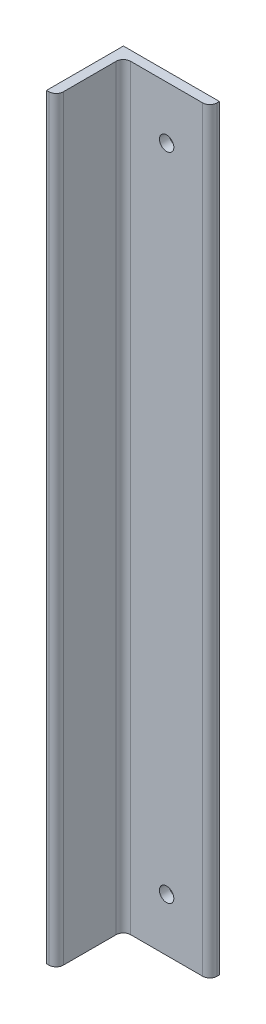
ISO-10303-21;
HEADER;
FILE_DESCRIPTION(('STEP AP214'),'2;1');
FILE_NAME('part.step','',(''),(''),'','','');
FILE_SCHEMA(('AUTOMOTIVE_DESIGN { 1 0 10303 214 1 1 1 1 }'));
ENDSEC;
DATA;
#1=APPLICATION_CONTEXT('core data for automotive mechanical design processes');
#2=APPLICATION_PROTOCOL_DEFINITION('international standard','automotive_design',2000,#1);
#3=PRODUCT_CONTEXT('',#1,'mechanical');
#4=PRODUCT('Part','Part','',(#3));
#5=PRODUCT_RELATED_PRODUCT_CATEGORY('part','',(#4));
#6=PRODUCT_DEFINITION_FORMATION('','',#4);
#7=PRODUCT_DEFINITION_CONTEXT('part definition',#1,'design');
#8=PRODUCT_DEFINITION('design','',#6,#7);
#9=PRODUCT_DEFINITION_SHAPE('','',#8);
#10=(LENGTH_UNIT() NAMED_UNIT(*) SI_UNIT(.MILLI.,.METRE.));
#11=(NAMED_UNIT(*) PLANE_ANGLE_UNIT() SI_UNIT($,.RADIAN.));
#12=(NAMED_UNIT(*) SI_UNIT($,.STERADIAN.) SOLID_ANGLE_UNIT());
#13=UNCERTAINTY_MEASURE_WITH_UNIT(LENGTH_MEASURE(1.E-05),#10,'distance_accuracy_value','');
#14=(GEOMETRIC_REPRESENTATION_CONTEXT(3) GLOBAL_UNCERTAINTY_ASSIGNED_CONTEXT((#13)) GLOBAL_UNIT_ASSIGNED_CONTEXT((#10,
#11,#12)) REPRESENTATION_CONTEXT('',''));
#15=CARTESIAN_POINT('',(0.,0.,0.));
#16=DIRECTION('',(0.,0.,1.));
#17=DIRECTION('',(1.,0.,0.));
#18=AXIS2_PLACEMENT_3D('',#15,#16,#17);
#19=CARTESIAN_POINT('',(0.,500.,50.7999999999999));
#20=DIRECTION('',(1.,0.,0.));
#21=DIRECTION('',(0.,0.,-1.));
#22=AXIS2_PLACEMENT_3D('',#19,#20,#21);
#23=PLANE('',#22);
#24=DIRECTION('',(0.,0.,1.));
#25=VECTOR('',#24,1.);
#26=CARTESIAN_POINT('',(0.,0.,50.7999999999999));
#27=LINE('',#26,#25);
#28=CARTESIAN_POINT('',(0.,0.,0.));
#29=VERTEX_POINT('',#28);
#30=CARTESIAN_POINT('',(0.,0.,50.7999999999999));
#31=VERTEX_POINT('',#30);
#32=EDGE_CURVE('E168',#29,#31,#27,.T.);
#33=ORIENTED_EDGE('',*,*,#32,.T.);
#34=DIRECTION('',(0.,-1.,0.));
#35=VECTOR('',#34,1.);
#36=CARTESIAN_POINT('',(0.,500.,50.7999999999999));
#37=LINE('',#36,#35);
#38=CARTESIAN_POINT('',(0.,500.,50.7999999999999));
#39=VERTEX_POINT('',#38);
#40=EDGE_CURVE('E13',#39,#31,#37,.T.);
#41=ORIENTED_EDGE('',*,*,#40,.F.);
#42=DIRECTION('',(0.,0.,1.));
#43=VECTOR('',#42,1.);
#44=CARTESIAN_POINT('',(0.,500.,50.7999999999999));
#45=LINE('',#44,#43);
#46=CARTESIAN_POINT('',(0.,500.,0.));
#47=VERTEX_POINT('',#46);
#48=EDGE_CURVE('E185',#47,#39,#45,.T.);
#49=ORIENTED_EDGE('',*,*,#48,.F.);
#50=DIRECTION('',(0.,-1.,0.));
#51=VECTOR('',#50,1.);
#52=CARTESIAN_POINT('',(0.,500.,0.));
#53=LINE('',#52,#51);
#54=EDGE_CURVE('E164',#47,#29,#53,.T.);
#55=ORIENTED_EDGE('',*,*,#54,.T.);
#56=EDGE_LOOP('',(#33,#41,#49,#55));
#57=FACE_BOUND('',#56,.T.);
#58=ADVANCED_FACE('F66',(#57),#23,.F.);
#59=CARTESIAN_POINT('',(1.59258,500.,50.7999999999999));
#60=DIRECTION('',(0.,0.,-1.));
#61=DIRECTION('',(-1.,0.,0.));
#62=AXIS2_PLACEMENT_3D('',#59,#60,#61);
#63=PLANE('',#62);
#64=DIRECTION('',(1.,0.,0.));
#65=VECTOR('',#64,1.);
#66=CARTESIAN_POINT('',(1.59258,0.,50.7999999999999));
#67=LINE('',#66,#65);
#68=CARTESIAN_POINT('',(1.59258,0.,50.7999999999999));
#69=VERTEX_POINT('',#68);
#70=EDGE_CURVE('E171',#31,#69,#67,.T.);
#71=ORIENTED_EDGE('',*,*,#70,.T.);
#72=DIRECTION('',(0.,-1.,0.));
#73=VECTOR('',#72,1.);
#74=CARTESIAN_POINT('',(1.59258,500.,50.7999999999999));
#75=LINE('',#74,#73);
#76=CARTESIAN_POINT('',(1.59258,500.,50.7999999999999));
#77=VERTEX_POINT('',#76);
#78=EDGE_CURVE('E74',#77,#69,#75,.T.);
#79=ORIENTED_EDGE('',*,*,#78,.F.);
#80=DIRECTION('',(1.,0.,0.));
#81=VECTOR('',#80,1.);
#82=CARTESIAN_POINT('',(1.59258,500.,50.7999999999999));
#83=LINE('',#82,#81);
#84=EDGE_CURVE('E128',#39,#77,#83,.T.);
#85=ORIENTED_EDGE('',*,*,#84,.F.);
#86=ORIENTED_EDGE('',*,*,#40,.T.);
#87=EDGE_LOOP('',(#71,#79,#85,#86));
#88=FACE_BOUND('',#87,.T.);
#89=ADVANCED_FACE('F267',(#88),#63,.F.);
#90=CARTESIAN_POINT('',(1.59258,500.,46.0425799999999));
#91=DIRECTION('',(0.,-1.,0.));
#92=DIRECTION('',(0.,0.,-1.));
#93=AXIS2_PLACEMENT_3D('',#90,#91,#92);
#94=CYLINDRICAL_SURFACE('',#93,4.75742);
#95=CARTESIAN_POINT('',(1.59258,0.,46.0425799999999));
#96=DIRECTION('',(0.,1.,0.));
#97=DIRECTION('',(0.,0.,1.));
#98=AXIS2_PLACEMENT_3D('',#95,#96,#97);
#99=CIRCLE('',#98,4.75742);
#100=CARTESIAN_POINT('',(6.34999999999999,0.,46.0425799999999));
#101=VERTEX_POINT('',#100);
#102=EDGE_CURVE('E174',#69,#101,#99,.T.);
#103=ORIENTED_EDGE('',*,*,#102,.T.);
#104=DIRECTION('',(0.,-1.,0.));
#105=VECTOR('',#104,1.);
#106=CARTESIAN_POINT('',(6.34999999999999,500.,46.0425799999999));
#107=LINE('',#106,#105);
#108=CARTESIAN_POINT('',(6.34999999999999,500.,46.0425799999999));
#109=VERTEX_POINT('',#108);
#110=EDGE_CURVE('E195',#109,#101,#107,.T.);
#111=ORIENTED_EDGE('',*,*,#110,.F.);
#112=CARTESIAN_POINT('',(1.59258,500.,46.0425799999999));
#113=DIRECTION('',(0.,1.,0.));
#114=DIRECTION('',(0.,0.,1.));
#115=AXIS2_PLACEMENT_3D('',#112,#113,#114);
#116=CIRCLE('',#115,4.75742);
#117=EDGE_CURVE('E203',#77,#109,#116,.T.);
#118=ORIENTED_EDGE('',*,*,#117,.F.);
#119=ORIENTED_EDGE('',*,*,#78,.T.);
#120=EDGE_LOOP('',(#103,#111,#118,#119));
#121=FACE_BOUND('',#120,.T.);
#122=ADVANCED_FACE('F201',(#121),#94,.T.);
#123=CARTESIAN_POINT('',(6.34999999999999,500.,11.1125));
#124=DIRECTION('',(-1.,0.,0.));
#125=DIRECTION('',(0.,0.,1.));
#126=AXIS2_PLACEMENT_3D('',#123,#124,#125);
#127=PLANE('',#126);
#128=DIRECTION('',(0.,0.,-1.));
#129=VECTOR('',#128,1.);
#130=CARTESIAN_POINT('',(6.34999999999999,0.,11.1125));
#131=LINE('',#130,#129);
#132=CARTESIAN_POINT('',(6.35,0.,11.1125));
#133=VERTEX_POINT('',#132);
#134=EDGE_CURVE('E176',#101,#133,#131,.T.);
#135=ORIENTED_EDGE('',*,*,#134,.T.);
#136=DIRECTION('',(0.,-1.,0.));
#137=VECTOR('',#136,1.);
#138=CARTESIAN_POINT('',(6.35,500.,11.1125));
#139=LINE('',#138,#137);
#140=CARTESIAN_POINT('',(6.35,500.,11.1125));
#141=VERTEX_POINT('',#140);
#142=EDGE_CURVE('E192',#141,#133,#139,.T.);
#143=ORIENTED_EDGE('',*,*,#142,.F.);
#144=DIRECTION('',(0.,0.,-1.));
#145=VECTOR('',#144,1.);
#146=CARTESIAN_POINT('',(6.34999999999999,500.,11.1125));
#147=LINE('',#146,#145);
#148=EDGE_CURVE('E219',#109,#141,#147,.T.);
#149=ORIENTED_EDGE('',*,*,#148,.F.);
#150=ORIENTED_EDGE('',*,*,#110,.T.);
#151=EDGE_LOOP('',(#135,#143,#149,#150));
#152=FACE_BOUND('',#151,.T.);
#153=ADVANCED_FACE('F212',(#152),#127,.F.);
#154=CARTESIAN_POINT('',(11.1125,500.,11.1125));
#155=DIRECTION('',(0.,-1.,0.));
#156=DIRECTION('',(0.,0.,-1.));
#157=AXIS2_PLACEMENT_3D('',#154,#155,#156);
#158=CYLINDRICAL_SURFACE('',#157,4.7625);
#159=CARTESIAN_POINT('',(11.1125,0.,11.1125));
#160=DIRECTION('',(0.,-1.,0.));
#161=DIRECTION('',(0.,0.,-1.));
#162=AXIS2_PLACEMENT_3D('',#159,#160,#161);
#163=CIRCLE('',#162,4.7625);
#164=CARTESIAN_POINT('',(11.1125,0.,6.34999999999998));
#165=VERTEX_POINT('',#164);
#166=EDGE_CURVE('E178',#133,#165,#163,.T.);
#167=ORIENTED_EDGE('',*,*,#166,.T.);
#168=DIRECTION('',(0.,-1.,0.));
#169=VECTOR('',#168,1.);
#170=CARTESIAN_POINT('',(11.1125,500.,6.34999999999998));
#171=LINE('',#170,#169);
#172=CARTESIAN_POINT('',(11.1125,500.,6.34999999999998));
#173=VERTEX_POINT('',#172);
#174=EDGE_CURVE('E189',#173,#165,#171,.T.);
#175=ORIENTED_EDGE('',*,*,#174,.F.);
#176=CARTESIAN_POINT('',(11.1125,500.,11.1125));
#177=DIRECTION('',(0.,-1.,0.));
#178=DIRECTION('',(0.,0.,-1.));
#179=AXIS2_PLACEMENT_3D('',#176,#177,#178);
#180=CIRCLE('',#179,4.7625);
#181=EDGE_CURVE('E218',#141,#173,#180,.T.);
#182=ORIENTED_EDGE('',*,*,#181,.F.);
#183=ORIENTED_EDGE('',*,*,#142,.T.);
#184=EDGE_LOOP('',(#167,#175,#182,#183));
#185=FACE_BOUND('',#184,.T.);
#186=ADVANCED_FACE('F216',(#185),#158,.F.);
#187=CARTESIAN_POINT('',(58.74258,500.,6.34999999999997));
#188=DIRECTION('',(0.,0.,-1.));
#189=DIRECTION('',(-1.,0.,0.));
#190=AXIS2_PLACEMENT_3D('',#187,#188,#189);
#191=PLANE('',#190);
#192=CARTESIAN_POINT('',(34.92754,465.,6.34999999999998));
#193=DIRECTION('',(0.,0.,1.));
#194=DIRECTION('',(1.,0.,0.));
#195=AXIS2_PLACEMENT_3D('',#192,#193,#194);
#196=CIRCLE('',#195,4.7625);
#197=CARTESIAN_POINT('',(39.69004,465.,6.34999999999998));
#198=VERTEX_POINT('',#197);
#199=EDGE_CURVE('E232',#198,#198,#196,.T.);
#200=ORIENTED_EDGE('',*,*,#199,.F.);
#201=EDGE_LOOP('',(#200));
#202=FACE_BOUND('',#201,.T.);
#203=CARTESIAN_POINT('',(34.9275400000001,35.,6.34999999999998));
#204=DIRECTION('',(0.,0.,1.));
#205=DIRECTION('',(1.,0.,0.));
#206=AXIS2_PLACEMENT_3D('',#203,#204,#205);
#207=CIRCLE('',#206,4.7625);
#208=CARTESIAN_POINT('',(39.6900400000001,35.,6.34999999999998));
#209=VERTEX_POINT('',#208);
#210=EDGE_CURVE('E226',#209,#209,#207,.T.);
#211=ORIENTED_EDGE('',*,*,#210,.F.);
#212=EDGE_LOOP('',(#211));
#213=FACE_BOUND('',#212,.T.);
#214=DIRECTION('',(1.,0.,0.));
#215=VECTOR('',#214,1.);
#216=CARTESIAN_POINT('',(58.74258,0.,6.34999999999997));
#217=LINE('',#216,#215);
#218=CARTESIAN_POINT('',(58.74258,0.,6.34999999999998));
#219=VERTEX_POINT('',#218);
#220=EDGE_CURVE('E180',#165,#219,#217,.T.);
#221=ORIENTED_EDGE('',*,*,#220,.T.);
#222=DIRECTION('',(0.,-1.,0.));
#223=VECTOR('',#222,1.);
#224=CARTESIAN_POINT('',(58.74258,500.,6.34999999999998));
#225=LINE('',#224,#223);
#226=CARTESIAN_POINT('',(58.74258,500.,6.34999999999998));
#227=VERTEX_POINT('',#226);
#228=EDGE_CURVE('E159',#227,#219,#225,.T.);
#229=ORIENTED_EDGE('',*,*,#228,.F.);
#230=DIRECTION('',(1.,0.,0.));
#231=VECTOR('',#230,1.);
#232=CARTESIAN_POINT('',(58.74258,500.,6.34999999999997));
#233=LINE('',#232,#231);
#234=EDGE_CURVE('E150',#173,#227,#233,.T.);
#235=ORIENTED_EDGE('',*,*,#234,.F.);
#236=ORIENTED_EDGE('',*,*,#174,.T.);
#237=EDGE_LOOP('',(#221,#229,#235,#236));
#238=FACE_BOUND('',#237,.T.);
#239=ADVANCED_FACE('F248',(#202,#213,#238),#191,.F.);
#240=CARTESIAN_POINT('',(58.74258,500.,1.59257999999997));
#241=DIRECTION('',(0.,-1.,0.));
#242=DIRECTION('',(0.,0.,-1.));
#243=AXIS2_PLACEMENT_3D('',#240,#241,#242);
#244=CYLINDRICAL_SURFACE('',#243,4.75742);
#245=CARTESIAN_POINT('',(58.74258,0.,1.59257999999997));
#246=DIRECTION('',(0.,1.,0.));
#247=DIRECTION('',(0.,0.,-1.));
#248=AXIS2_PLACEMENT_3D('',#245,#246,#247);
#249=CIRCLE('',#248,4.75742);
#250=CARTESIAN_POINT('',(63.5,0.,1.59257999999997));
#251=VERTEX_POINT('',#250);
#252=EDGE_CURVE('E158',#219,#251,#249,.T.);
#253=ORIENTED_EDGE('',*,*,#252,.T.);
#254=DIRECTION('',(0.,-1.,0.));
#255=VECTOR('',#254,1.);
#256=CARTESIAN_POINT('',(63.5,500.,1.59257999999997));
#257=LINE('',#256,#255);
#258=CARTESIAN_POINT('',(63.5,500.,1.59257999999997));
#259=VERTEX_POINT('',#258);
#260=EDGE_CURVE('E155',#259,#251,#257,.T.);
#261=ORIENTED_EDGE('',*,*,#260,.F.);
#262=CARTESIAN_POINT('',(58.74258,500.,1.59257999999997));
#263=DIRECTION('',(0.,1.,0.));
#264=DIRECTION('',(0.,0.,-1.));
#265=AXIS2_PLACEMENT_3D('',#262,#263,#264);
#266=CIRCLE('',#265,4.75742);
#267=EDGE_CURVE('E144',#227,#259,#266,.T.);
#268=ORIENTED_EDGE('',*,*,#267,.F.);
#269=ORIENTED_EDGE('',*,*,#228,.T.);
#270=EDGE_LOOP('',(#253,#261,#268,#269));
#271=FACE_BOUND('',#270,.T.);
#272=ADVANCED_FACE('F156',(#271),#244,.T.);
#273=CARTESIAN_POINT('',(63.5,500.,0.));
#274=DIRECTION('',(-1.,0.,0.));
#275=DIRECTION('',(0.,0.,1.));
#276=AXIS2_PLACEMENT_3D('',#273,#274,#275);
#277=PLANE('',#276);
#278=DIRECTION('',(0.,0.,-1.));
#279=VECTOR('',#278,1.);
#280=CARTESIAN_POINT('',(63.5,0.,0.));
#281=LINE('',#280,#279);
#282=CARTESIAN_POINT('',(63.5,0.,0.));
#283=VERTEX_POINT('',#282);
#284=EDGE_CURVE('E114',#251,#283,#281,.T.);
#285=ORIENTED_EDGE('',*,*,#284,.T.);
#286=DIRECTION('',(0.,-1.,0.));
#287=VECTOR('',#286,1.);
#288=CARTESIAN_POINT('',(63.5,500.,0.));
#289=LINE('',#288,#287);
#290=CARTESIAN_POINT('',(63.5,500.,0.));
#291=VERTEX_POINT('',#290);
#292=EDGE_CURVE('E160',#291,#283,#289,.T.);
#293=ORIENTED_EDGE('',*,*,#292,.F.);
#294=DIRECTION('',(0.,0.,-1.));
#295=VECTOR('',#294,1.);
#296=CARTESIAN_POINT('',(63.5,500.,0.));
#297=LINE('',#296,#295);
#298=EDGE_CURVE('E148',#259,#291,#297,.T.);
#299=ORIENTED_EDGE('',*,*,#298,.F.);
#300=ORIENTED_EDGE('',*,*,#260,.T.);
#301=EDGE_LOOP('',(#285,#293,#299,#300));
#302=FACE_BOUND('',#301,.T.);
#303=ADVANCED_FACE('F162',(#302),#277,.F.);
#304=CARTESIAN_POINT('',(0.,500.,0.));
#305=DIRECTION('',(0.,0.,1.));
#306=DIRECTION('',(1.,0.,0.));
#307=AXIS2_PLACEMENT_3D('',#304,#305,#306);
#308=PLANE('',#307);
#309=CARTESIAN_POINT('',(34.92754,465.,0.));
#310=DIRECTION('',(0.,0.,1.));
#311=DIRECTION('',(1.,0.,0.));
#312=AXIS2_PLACEMENT_3D('',#309,#310,#311);
#313=CIRCLE('',#312,4.7625);
#314=CARTESIAN_POINT('',(39.69004,465.,0.));
#315=VERTEX_POINT('',#314);
#316=EDGE_CURVE('E172',#315,#315,#313,.T.);
#317=ORIENTED_EDGE('',*,*,#316,.T.);
#318=EDGE_LOOP('',(#317));
#319=FACE_BOUND('',#318,.T.);
#320=CARTESIAN_POINT('',(34.9275400000001,35.,0.));
#321=DIRECTION('',(0.,0.,1.));
#322=DIRECTION('',(1.,0.,0.));
#323=AXIS2_PLACEMENT_3D('',#320,#321,#322);
#324=CIRCLE('',#323,4.7625);
#325=CARTESIAN_POINT('',(39.6900400000001,35.,0.));
#326=VERTEX_POINT('',#325);
#327=EDGE_CURVE('E229',#326,#326,#324,.T.);
#328=ORIENTED_EDGE('',*,*,#327,.T.);
#329=EDGE_LOOP('',(#328));
#330=FACE_BOUND('',#329,.T.);
#331=DIRECTION('',(-1.,0.,0.));
#332=VECTOR('',#331,1.);
#333=CARTESIAN_POINT('',(0.,0.,0.));
#334=LINE('',#333,#332);
#335=EDGE_CURVE('E120',#283,#29,#334,.T.);
#336=ORIENTED_EDGE('',*,*,#335,.T.);
#337=ORIENTED_EDGE('',*,*,#54,.F.);
#338=DIRECTION('',(-1.,0.,0.));
#339=VECTOR('',#338,1.);
#340=CARTESIAN_POINT('',(0.,500.,0.));
#341=LINE('',#340,#339);
#342=EDGE_CURVE('E82',#291,#47,#341,.T.);
#343=ORIENTED_EDGE('',*,*,#342,.F.);
#344=ORIENTED_EDGE('',*,*,#292,.T.);
#345=EDGE_LOOP('',(#336,#337,#343,#344));
#346=FACE_BOUND('',#345,.T.);
#347=ADVANCED_FACE('F238',(#319,#330,#346),#308,.F.);
#348=CARTESIAN_POINT('',(58.74258,500.,1.59257999999997));
#349=DIRECTION('',(0.,-1.,0.));
#350=DIRECTION('',(0.,0.,-1.));
#351=AXIS2_PLACEMENT_3D('',#348,#349,#350);
#352=PLANE('',#351);
#353=ORIENTED_EDGE('',*,*,#48,.T.);
#354=ORIENTED_EDGE('',*,*,#84,.T.);
#355=ORIENTED_EDGE('',*,*,#117,.T.);
#356=ORIENTED_EDGE('',*,*,#148,.T.);
#357=ORIENTED_EDGE('',*,*,#181,.T.);
#358=ORIENTED_EDGE('',*,*,#234,.T.);
#359=ORIENTED_EDGE('',*,*,#267,.T.);
#360=ORIENTED_EDGE('',*,*,#298,.T.);
#361=ORIENTED_EDGE('',*,*,#342,.T.);
#362=EDGE_LOOP('',(#353,#354,#355,#356,#357,#358,#359,#360,#361));
#363=FACE_BOUND('',#362,.T.);
#364=ADVANCED_FACE('F146',(#363),#352,.F.);
#365=CARTESIAN_POINT('',(58.74258,0.,1.59257999999997));
#366=DIRECTION('',(0.,-1.,0.));
#367=DIRECTION('',(0.,0.,-1.));
#368=AXIS2_PLACEMENT_3D('',#365,#366,#367);
#369=PLANE('',#368);
#370=ORIENTED_EDGE('',*,*,#32,.F.);
#371=ORIENTED_EDGE('',*,*,#335,.F.);
#372=ORIENTED_EDGE('',*,*,#284,.F.);
#373=ORIENTED_EDGE('',*,*,#252,.F.);
#374=ORIENTED_EDGE('',*,*,#220,.F.);
#375=ORIENTED_EDGE('',*,*,#166,.F.);
#376=ORIENTED_EDGE('',*,*,#134,.F.);
#377=ORIENTED_EDGE('',*,*,#102,.F.);
#378=ORIENTED_EDGE('',*,*,#70,.F.);
#379=EDGE_LOOP('',(#370,#371,#372,#373,#374,#375,#376,#377,#378));
#380=FACE_BOUND('',#379,.T.);
#381=ADVANCED_FACE('F207',(#380),#369,.T.);
#382=CARTESIAN_POINT('',(34.9275400000001,35.,0.));
#383=DIRECTION('',(0.,0.,1.));
#384=DIRECTION('',(1.,0.,0.));
#385=AXIS2_PLACEMENT_3D('',#382,#383,#384);
#386=CYLINDRICAL_SURFACE('',#385,4.7625);
#387=CARTESIAN_POINT('',(39.6900400000001,35.,0.));
#388=CARTESIAN_POINT('',(39.6900400000001,35.,0.0661458333333022));
#389=CARTESIAN_POINT('',(39.6900400000001,35.,0.132291666666636));
#390=CARTESIAN_POINT('',(39.6900400000001,35.,0.264583333333303));
#391=CARTESIAN_POINT('',(39.6900400000001,35.,0.330729166666636));
#392=CARTESIAN_POINT('',(39.6900400000001,35.,0.463020833333303));
#393=CARTESIAN_POINT('',(39.6900400000001,35.,0.529166666666637));
#394=CARTESIAN_POINT('',(39.6900400000001,35.,0.661458333333304));
#395=CARTESIAN_POINT('',(39.6900400000001,35.,0.727604166666637));
#396=CARTESIAN_POINT('',(39.6900400000001,35.,0.859895833333304));
#397=CARTESIAN_POINT('',(39.6900400000001,35.,0.926041666666638));
#398=CARTESIAN_POINT('',(39.6900400000001,35.,1.0583333333333));
#399=CARTESIAN_POINT('',(39.6900400000001,35.,1.12447916666664));
#400=CARTESIAN_POINT('',(39.6900400000001,35.,1.2567708333333));
#401=CARTESIAN_POINT('',(39.6900400000001,35.,1.32291666666664));
#402=CARTESIAN_POINT('',(39.6900400000001,35.,1.45520833333331));
#403=CARTESIAN_POINT('',(39.6900400000001,35.,1.52135416666664));
#404=CARTESIAN_POINT('',(39.6900400000001,35.,1.65364583333331));
#405=CARTESIAN_POINT('',(39.6900400000001,35.,1.71979166666664));
#406=CARTESIAN_POINT('',(39.6900400000001,35.,1.85208333333331));
#407=CARTESIAN_POINT('',(39.6900400000001,35.,1.91822916666664));
#408=CARTESIAN_POINT('',(39.6900400000001,35.,2.05052083333331));
#409=CARTESIAN_POINT('',(39.6900400000001,35.,2.11666666666664));
#410=CARTESIAN_POINT('',(39.6900400000001,35.,2.24895833333331));
#411=CARTESIAN_POINT('',(39.6900400000001,35.,2.31510416666664));
#412=CARTESIAN_POINT('',(39.6900400000001,35.,2.44739583333331));
#413=CARTESIAN_POINT('',(39.6900400000001,35.,2.51354166666664));
#414=CARTESIAN_POINT('',(39.6900400000001,35.,2.64583333333331));
#415=CARTESIAN_POINT('',(39.6900400000001,35.,2.71197916666664));
#416=CARTESIAN_POINT('',(39.6900400000001,35.,2.84427083333331));
#417=CARTESIAN_POINT('',(39.6900400000001,35.,2.91041666666664));
#418=CARTESIAN_POINT('',(39.6900400000001,35.,3.04270833333331));
#419=CARTESIAN_POINT('',(39.6900400000001,35.,3.10885416666664));
#420=CARTESIAN_POINT('',(39.6900400000001,35.,3.24114583333331));
#421=CARTESIAN_POINT('',(39.6900400000001,35.,3.30729166666664));
#422=CARTESIAN_POINT('',(39.6900400000001,35.,3.43958333333331));
#423=CARTESIAN_POINT('',(39.6900400000001,35.,3.50572916666664));
#424=CARTESIAN_POINT('',(39.6900400000001,35.,3.63802083333331));
#425=CARTESIAN_POINT('',(39.6900400000001,35.,3.70416666666664));
#426=CARTESIAN_POINT('',(39.6900400000001,35.,3.83645833333331));
#427=CARTESIAN_POINT('',(39.6900400000001,35.,3.90260416666664));
#428=CARTESIAN_POINT('',(39.6900400000001,35.,4.03489583333331));
#429=CARTESIAN_POINT('',(39.6900400000001,35.,4.10104166666664));
#430=CARTESIAN_POINT('',(39.6900400000001,35.,4.23333333333331));
#431=CARTESIAN_POINT('',(39.6900400000001,35.,4.29947916666664));
#432=CARTESIAN_POINT('',(39.6900400000001,35.,4.43177083333331));
#433=CARTESIAN_POINT('',(39.6900400000001,35.,4.49791666666664));
#434=CARTESIAN_POINT('',(39.6900400000001,35.,4.63020833333331));
#435=CARTESIAN_POINT('',(39.6900400000001,35.,4.69635416666665));
#436=CARTESIAN_POINT('',(39.6900400000001,35.,4.82864583333331));
#437=CARTESIAN_POINT('',(39.6900400000001,35.,4.89479166666665));
#438=CARTESIAN_POINT('',(39.6900400000001,35.,5.02708333333331));
#439=CARTESIAN_POINT('',(39.6900400000001,35.,5.09322916666665));
#440=CARTESIAN_POINT('',(39.6900400000001,35.,5.22552083333331));
#441=CARTESIAN_POINT('',(39.6900400000001,35.,5.29166666666665));
#442=CARTESIAN_POINT('',(39.6900400000001,35.,5.42395833333331));
#443=CARTESIAN_POINT('',(39.6900400000001,35.,5.49010416666665));
#444=CARTESIAN_POINT('',(39.6900400000001,35.,5.62239583333332));
#445=CARTESIAN_POINT('',(39.6900400000001,35.,5.68854166666665));
#446=CARTESIAN_POINT('',(39.6900400000001,35.,5.82083333333332));
#447=CARTESIAN_POINT('',(39.6900400000001,35.,5.88697916666665));
#448=CARTESIAN_POINT('',(39.6900400000001,35.,6.01927083333332));
#449=CARTESIAN_POINT('',(39.6900400000001,35.,6.08541666666665));
#450=CARTESIAN_POINT('',(39.6900400000001,35.,6.21770833333332));
#451=CARTESIAN_POINT('',(39.6900400000001,35.,6.28385416666665));
#452=CARTESIAN_POINT('',(39.6900400000001,35.,6.34999999999998));
#453=B_SPLINE_CURVE_WITH_KNOTS('',3,(#387,#388,#389,#390,#391,#392,#393,#394,#395,#396,#397,
#398,#399,#400,#401,#402,#403,#404,#405,#406,#407,#408,#409,#410,#411,#412,#413,#414,#415,#416,
#417,#418,#419,#420,#421,#422,#423,#424,#425,#426,#427,#428,#429,#430,#431,#432,#433,#434,#435,
#436,#437,#438,#439,#440,#441,#442,#443,#444,#445,#446,#447,#448,#449,#450,#451,#452),
.UNSPECIFIED.,.F.,.F.,(4,2,2,2,2,2,2,2,2,2,2,2,2,2,2,2,2,2,2,2,2,2,2,2,2,2,2,2,2,2,2,2,4),(0.,
0.1984375,0.396875000000001,0.595312500000001,0.793750000000002,0.992187500000002,1.190625,
1.3890625,1.5875,1.7859375,1.984375,2.1828125,2.38125000000001,2.57968750000001,
2.77812500000001,2.97656250000001,3.17500000000001,3.37343750000001,3.57187500000001,
3.77031250000001,3.96875000000001,4.16718750000001,4.36562500000001,4.56406250000001,
4.76250000000001,4.96093750000001,5.15937500000001,5.35781250000001,5.55625000000001,
5.75468750000001,5.95312500000001,6.15156250000001,6.35000000000001),.UNSPECIFIED.);
#454=EDGE_CURVE('BSEAM244',#326,#209,#453,.T.);
#455=ORIENTED_EDGE('',*,*,#327,.F.);
#456=ORIENTED_EDGE('',*,*,#210,.T.);
#457=ORIENTED_EDGE('',*,*,#454,.T.);
#458=ORIENTED_EDGE('',*,*,#454,.F.);
#459=EDGE_LOOP('',(#455,#457,#456,#458));
#460=FACE_BOUND('',#459,.T.);
#461=ADVANCED_FACE('F244',(#460),#386,.F.);
#462=CARTESIAN_POINT('',(34.92754,465.,0.));
#463=DIRECTION('',(0.,0.,1.));
#464=DIRECTION('',(1.,0.,0.));
#465=AXIS2_PLACEMENT_3D('',#462,#463,#464);
#466=CYLINDRICAL_SURFACE('',#465,4.7625);
#467=CARTESIAN_POINT('',(39.69004,465.,0.));
#468=CARTESIAN_POINT('',(39.69004,465.,0.0661458333333022));
#469=CARTESIAN_POINT('',(39.69004,465.,0.132291666666636));
#470=CARTESIAN_POINT('',(39.69004,465.,0.264583333333303));
#471=CARTESIAN_POINT('',(39.69004,465.,0.330729166666636));
#472=CARTESIAN_POINT('',(39.69004,465.,0.463020833333303));
#473=CARTESIAN_POINT('',(39.69004,465.,0.529166666666637));
#474=CARTESIAN_POINT('',(39.69004,465.,0.661458333333304));
#475=CARTESIAN_POINT('',(39.69004,465.,0.727604166666637));
#476=CARTESIAN_POINT('',(39.69004,465.,0.859895833333304));
#477=CARTESIAN_POINT('',(39.69004,465.,0.926041666666638));
#478=CARTESIAN_POINT('',(39.69004,465.,1.0583333333333));
#479=CARTESIAN_POINT('',(39.69004,465.,1.12447916666664));
#480=CARTESIAN_POINT('',(39.69004,465.,1.2567708333333));
#481=CARTESIAN_POINT('',(39.69004,465.,1.32291666666664));
#482=CARTESIAN_POINT('',(39.69004,465.,1.45520833333331));
#483=CARTESIAN_POINT('',(39.69004,465.,1.52135416666664));
#484=CARTESIAN_POINT('',(39.69004,465.,1.65364583333331));
#485=CARTESIAN_POINT('',(39.69004,465.,1.71979166666664));
#486=CARTESIAN_POINT('',(39.69004,465.,1.85208333333331));
#487=CARTESIAN_POINT('',(39.69004,465.,1.91822916666664));
#488=CARTESIAN_POINT('',(39.69004,465.,2.05052083333331));
#489=CARTESIAN_POINT('',(39.69004,465.,2.11666666666664));
#490=CARTESIAN_POINT('',(39.69004,465.,2.24895833333331));
#491=CARTESIAN_POINT('',(39.69004,465.,2.31510416666664));
#492=CARTESIAN_POINT('',(39.69004,465.,2.44739583333331));
#493=CARTESIAN_POINT('',(39.69004,465.,2.51354166666664));
#494=CARTESIAN_POINT('',(39.69004,465.,2.64583333333331));
#495=CARTESIAN_POINT('',(39.69004,465.,2.71197916666664));
#496=CARTESIAN_POINT('',(39.69004,465.,2.84427083333331));
#497=CARTESIAN_POINT('',(39.69004,465.,2.91041666666664));
#498=CARTESIAN_POINT('',(39.69004,465.,3.04270833333331));
#499=CARTESIAN_POINT('',(39.69004,465.,3.10885416666664));
#500=CARTESIAN_POINT('',(39.69004,465.,3.24114583333331));
#501=CARTESIAN_POINT('',(39.69004,465.,3.30729166666664));
#502=CARTESIAN_POINT('',(39.69004,465.,3.43958333333331));
#503=CARTESIAN_POINT('',(39.69004,465.,3.50572916666664));
#504=CARTESIAN_POINT('',(39.69004,465.,3.63802083333331));
#505=CARTESIAN_POINT('',(39.69004,465.,3.70416666666664));
#506=CARTESIAN_POINT('',(39.69004,465.,3.83645833333331));
#507=CARTESIAN_POINT('',(39.69004,465.,3.90260416666664));
#508=CARTESIAN_POINT('',(39.69004,465.,4.03489583333331));
#509=CARTESIAN_POINT('',(39.69004,465.,4.10104166666664));
#510=CARTESIAN_POINT('',(39.69004,465.,4.23333333333331));
#511=CARTESIAN_POINT('',(39.69004,465.,4.29947916666664));
#512=CARTESIAN_POINT('',(39.69004,465.,4.43177083333331));
#513=CARTESIAN_POINT('',(39.69004,465.,4.49791666666664));
#514=CARTESIAN_POINT('',(39.69004,465.,4.63020833333331));
#515=CARTESIAN_POINT('',(39.69004,465.,4.69635416666665));
#516=CARTESIAN_POINT('',(39.69004,465.,4.82864583333331));
#517=CARTESIAN_POINT('',(39.69004,465.,4.89479166666665));
#518=CARTESIAN_POINT('',(39.69004,465.,5.02708333333331));
#519=CARTESIAN_POINT('',(39.69004,465.,5.09322916666665));
#520=CARTESIAN_POINT('',(39.69004,465.,5.22552083333331));
#521=CARTESIAN_POINT('',(39.69004,465.,5.29166666666665));
#522=CARTESIAN_POINT('',(39.69004,465.,5.42395833333331));
#523=CARTESIAN_POINT('',(39.69004,465.,5.49010416666665));
#524=CARTESIAN_POINT('',(39.69004,465.,5.62239583333332));
#525=CARTESIAN_POINT('',(39.69004,465.,5.68854166666665));
#526=CARTESIAN_POINT('',(39.69004,465.,5.82083333333332));
#527=CARTESIAN_POINT('',(39.69004,465.,5.88697916666665));
#528=CARTESIAN_POINT('',(39.69004,465.,6.01927083333332));
#529=CARTESIAN_POINT('',(39.69004,465.,6.08541666666665));
#530=CARTESIAN_POINT('',(39.69004,465.,6.21770833333332));
#531=CARTESIAN_POINT('',(39.69004,465.,6.28385416666665));
#532=CARTESIAN_POINT('',(39.69004,465.,6.34999999999998));
#533=B_SPLINE_CURVE_WITH_KNOTS('',3,(#467,#468,#469,#470,#471,#472,#473,#474,#475,#476,#477,
#478,#479,#480,#481,#482,#483,#484,#485,#486,#487,#488,#489,#490,#491,#492,#493,#494,#495,#496,
#497,#498,#499,#500,#501,#502,#503,#504,#505,#506,#507,#508,#509,#510,#511,#512,#513,#514,#515,
#516,#517,#518,#519,#520,#521,#522,#523,#524,#525,#526,#527,#528,#529,#530,#531,#532),
.UNSPECIFIED.,.F.,.F.,(4,2,2,2,2,2,2,2,2,2,2,2,2,2,2,2,2,2,2,2,2,2,2,2,2,2,2,2,2,2,2,2,4),(0.,
0.1984375,0.396875000000001,0.595312500000001,0.793750000000002,0.992187500000002,1.190625,
1.3890625,1.5875,1.7859375,1.984375,2.1828125,2.38125000000001,2.57968750000001,
2.77812500000001,2.97656250000001,3.17500000000001,3.37343750000001,3.57187500000001,
3.77031250000001,3.96875000000001,4.16718750000001,4.36562500000001,4.56406250000001,
4.76250000000001,4.96093750000001,5.15937500000001,5.35781250000001,5.55625000000001,
5.75468750000001,5.95312500000001,6.15156250000001,6.35000000000001),.UNSPECIFIED.);
#534=EDGE_CURVE('BSEAM241',#315,#198,#533,.T.);
#535=ORIENTED_EDGE('',*,*,#316,.F.);
#536=ORIENTED_EDGE('',*,*,#199,.T.);
#537=ORIENTED_EDGE('',*,*,#534,.T.);
#538=ORIENTED_EDGE('',*,*,#534,.F.);
#539=EDGE_LOOP('',(#535,#537,#536,#538));
#540=FACE_BOUND('',#539,.T.);
#541=ADVANCED_FACE('F241',(#540),#466,.F.);
#542=CLOSED_SHELL('',(#58,#89,#122,#153,#186,#239,#272,#303,#347,#364,#381,#461,#541));
#543=MANIFOLD_SOLID_BREP('B2',#542);
#544=ADVANCED_BREP_SHAPE_REPRESENTATION('',(#18,#543),#14);
#545=SHAPE_DEFINITION_REPRESENTATION(#9,#544);
ENDSEC;
END-ISO-10303-21;
